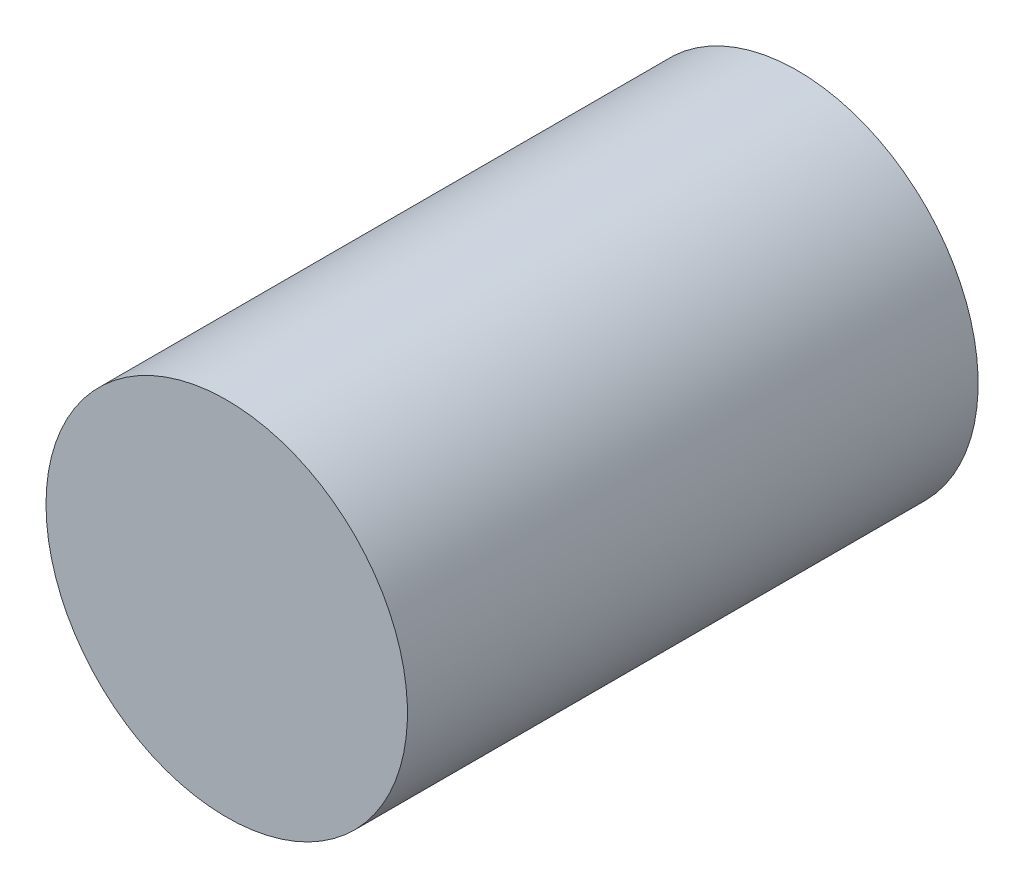
ISO-10303-21;
HEADER;
FILE_DESCRIPTION(('STEP AP214'),'2;1');
FILE_NAME('part.step','',(''),(''),'','','');
FILE_SCHEMA(('AUTOMOTIVE_DESIGN { 1 0 10303 214 1 1 1 1 }'));
ENDSEC;
DATA;
#1=APPLICATION_CONTEXT('core data for automotive mechanical design processes');
#2=APPLICATION_PROTOCOL_DEFINITION('international standard','automotive_design',2000,#1);
#3=PRODUCT_CONTEXT('',#1,'mechanical');
#4=PRODUCT('Part','Part','',(#3));
#5=PRODUCT_RELATED_PRODUCT_CATEGORY('part','',(#4));
#6=PRODUCT_DEFINITION_FORMATION('','',#4);
#7=PRODUCT_DEFINITION_CONTEXT('part definition',#1,'design');
#8=PRODUCT_DEFINITION('design','',#6,#7);
#9=PRODUCT_DEFINITION_SHAPE('','',#8);
#10=(LENGTH_UNIT() NAMED_UNIT(*) SI_UNIT(.MILLI.,.METRE.));
#11=(NAMED_UNIT(*) PLANE_ANGLE_UNIT() SI_UNIT($,.RADIAN.));
#12=(NAMED_UNIT(*) SI_UNIT($,.STERADIAN.) SOLID_ANGLE_UNIT());
#13=UNCERTAINTY_MEASURE_WITH_UNIT(LENGTH_MEASURE(1.E-05),#10,'distance_accuracy_value','');
#14=(GEOMETRIC_REPRESENTATION_CONTEXT(3) GLOBAL_UNCERTAINTY_ASSIGNED_CONTEXT((#13)) GLOBAL_UNIT_ASSIGNED_CONTEXT((#10,
#11,#12)) REPRESENTATION_CONTEXT('',''));
#15=CARTESIAN_POINT('',(0.,0.,0.));
#16=DIRECTION('',(0.,0.,1.));
#17=DIRECTION('',(1.,0.,0.));
#18=AXIS2_PLACEMENT_3D('',#15,#16,#17);
#19=CARTESIAN_POINT('',(-12.4312439650112,18.1884263878374,38.1));
#20=DIRECTION('',(0.,0.,-1.));
#21=DIRECTION('',(-1.,0.,0.));
#22=AXIS2_PLACEMENT_3D('',#19,#20,#21);
#23=CYLINDRICAL_SURFACE('',#22,12.065);
#24=CARTESIAN_POINT('',(-12.4312439650112,18.1884263878374,38.1));
#25=DIRECTION('',(0.,0.,1.));
#26=DIRECTION('',(1.,0.,0.));
#27=AXIS2_PLACEMENT_3D('',#24,#25,#26);
#28=CIRCLE('',#27,12.065);
#29=CARTESIAN_POINT('',(-24.4962439650112,18.1884263878374,38.1));
#30=VERTEX_POINT('',#29);
#31=EDGE_CURVE('E10',#30,#30,#28,.T.);
#32=CARTESIAN_POINT('',(-12.4312439650112,18.1884263878374,0.));
#33=DIRECTION('',(0.,0.,1.));
#34=DIRECTION('',(1.,0.,0.));
#35=AXIS2_PLACEMENT_3D('',#32,#33,#34);
#36=CIRCLE('',#35,12.065);
#37=CARTESIAN_POINT('',(-24.4962439650112,18.1884263878374,0.));
#38=VERTEX_POINT('',#37);
#39=EDGE_CURVE('E40',#38,#38,#36,.T.);
#40=CARTESIAN_POINT('',(-24.4962439650112,18.1884263878374,38.1));
#41=CARTESIAN_POINT('',(-24.4962439650112,18.1884263878374,37.703125));
#42=CARTESIAN_POINT('',(-24.4962439650112,18.1884263878374,37.30625));
#43=CARTESIAN_POINT('',(-24.4962439650112,18.1884263878374,36.5125));
#44=CARTESIAN_POINT('',(-24.4962439650112,18.1884263878374,36.115625));
#45=CARTESIAN_POINT('',(-24.4962439650112,18.1884263878374,35.321875));
#46=CARTESIAN_POINT('',(-24.4962439650112,18.1884263878374,34.925));
#47=CARTESIAN_POINT('',(-24.4962439650112,18.1884263878374,34.13125));
#48=CARTESIAN_POINT('',(-24.4962439650112,18.1884263878374,33.734375));
#49=CARTESIAN_POINT('',(-24.4962439650112,18.1884263878374,32.940625));
#50=CARTESIAN_POINT('',(-24.4962439650112,18.1884263878374,32.54375));
#51=CARTESIAN_POINT('',(-24.4962439650112,18.1884263878374,31.75));
#52=CARTESIAN_POINT('',(-24.4962439650112,18.1884263878374,31.353125));
#53=CARTESIAN_POINT('',(-24.4962439650112,18.1884263878374,30.559375));
#54=CARTESIAN_POINT('',(-24.4962439650112,18.1884263878374,30.1625));
#55=CARTESIAN_POINT('',(-24.4962439650112,18.1884263878374,29.36875));
#56=CARTESIAN_POINT('',(-24.4962439650112,18.1884263878374,28.971875));
#57=CARTESIAN_POINT('',(-24.4962439650112,18.1884263878374,28.178125));
#58=CARTESIAN_POINT('',(-24.4962439650112,18.1884263878374,27.78125));
#59=CARTESIAN_POINT('',(-24.4962439650112,18.1884263878374,26.9875));
#60=CARTESIAN_POINT('',(-24.4962439650112,18.1884263878374,26.590625));
#61=CARTESIAN_POINT('',(-24.4962439650112,18.1884263878374,25.796875));
#62=CARTESIAN_POINT('',(-24.4962439650112,18.1884263878374,25.4));
#63=CARTESIAN_POINT('',(-24.4962439650112,18.1884263878374,24.60625));
#64=CARTESIAN_POINT('',(-24.4962439650112,18.1884263878374,24.209375));
#65=CARTESIAN_POINT('',(-24.4962439650112,18.1884263878374,23.415625));
#66=CARTESIAN_POINT('',(-24.4962439650112,18.1884263878374,23.01875));
#67=CARTESIAN_POINT('',(-24.4962439650112,18.1884263878374,22.225));
#68=CARTESIAN_POINT('',(-24.4962439650112,18.1884263878374,21.828125));
#69=CARTESIAN_POINT('',(-24.4962439650112,18.1884263878374,21.034375));
#70=CARTESIAN_POINT('',(-24.4962439650112,18.1884263878374,20.6375));
#71=CARTESIAN_POINT('',(-24.4962439650112,18.1884263878374,19.84375));
#72=CARTESIAN_POINT('',(-24.4962439650112,18.1884263878374,19.446875));
#73=CARTESIAN_POINT('',(-24.4962439650112,18.1884263878374,18.653125));
#74=CARTESIAN_POINT('',(-24.4962439650112,18.1884263878374,18.25625));
#75=CARTESIAN_POINT('',(-24.4962439650112,18.1884263878374,17.4625));
#76=CARTESIAN_POINT('',(-24.4962439650112,18.1884263878374,17.065625));
#77=CARTESIAN_POINT('',(-24.4962439650112,18.1884263878374,16.271875));
#78=CARTESIAN_POINT('',(-24.4962439650112,18.1884263878374,15.875));
#79=CARTESIAN_POINT('',(-24.4962439650112,18.1884263878374,15.08125));
#80=CARTESIAN_POINT('',(-24.4962439650112,18.1884263878374,14.684375));
#81=CARTESIAN_POINT('',(-24.4962439650112,18.1884263878374,13.890625));
#82=CARTESIAN_POINT('',(-24.4962439650112,18.1884263878374,13.49375));
#83=CARTESIAN_POINT('',(-24.4962439650112,18.1884263878374,12.7));
#84=CARTESIAN_POINT('',(-24.4962439650112,18.1884263878374,12.303125));
#85=CARTESIAN_POINT('',(-24.4962439650112,18.1884263878374,11.509375));
#86=CARTESIAN_POINT('',(-24.4962439650112,18.1884263878374,11.1125));
#87=CARTESIAN_POINT('',(-24.4962439650112,18.1884263878374,10.31875));
#88=CARTESIAN_POINT('',(-24.4962439650112,18.1884263878374,9.92187499999999));
#89=CARTESIAN_POINT('',(-24.4962439650112,18.1884263878374,9.128125));
#90=CARTESIAN_POINT('',(-24.4962439650112,18.1884263878374,8.73124999999999));
#91=CARTESIAN_POINT('',(-24.4962439650112,18.1884263878374,7.93749999999999));
#92=CARTESIAN_POINT('',(-24.4962439650112,18.1884263878374,7.54062499999999));
#93=CARTESIAN_POINT('',(-24.4962439650112,18.1884263878374,6.746875));
#94=CARTESIAN_POINT('',(-24.4962439650112,18.1884263878374,6.35));
#95=CARTESIAN_POINT('',(-24.4962439650112,18.1884263878374,5.55625));
#96=CARTESIAN_POINT('',(-24.4962439650112,18.1884263878374,5.159375));
#97=CARTESIAN_POINT('',(-24.4962439650112,18.1884263878374,4.365625));
#98=CARTESIAN_POINT('',(-24.4962439650112,18.1884263878374,3.96875));
#99=CARTESIAN_POINT('',(-24.4962439650112,18.1884263878374,3.175));
#100=CARTESIAN_POINT('',(-24.4962439650112,18.1884263878374,2.778125));
#101=CARTESIAN_POINT('',(-24.4962439650112,18.1884263878374,1.984375));
#102=CARTESIAN_POINT('',(-24.4962439650112,18.1884263878374,1.5875));
#103=CARTESIAN_POINT('',(-24.4962439650112,18.1884263878374,0.79375));
#104=CARTESIAN_POINT('',(-24.4962439650112,18.1884263878374,0.396875));
#105=CARTESIAN_POINT('',(-24.4962439650112,18.1884263878374,0.));
#106=B_SPLINE_CURVE_WITH_KNOTS('',3,(#40,#41,#42,#43,#44,#45,#46,#47,#48,#49,#50,#51,#52,#53,
#54,#55,#56,#57,#58,#59,#60,#61,#62,#63,#64,#65,#66,#67,#68,#69,#70,#71,#72,#73,#74,#75,#76,#77,
#78,#79,#80,#81,#82,#83,#84,#85,#86,#87,#88,#89,#90,#91,#92,#93,#94,#95,#96,#97,#98,#99,#100,
#101,#102,#103,#104,#105),.UNSPECIFIED.,.F.,.F.,(4,2,2,2,2,2,2,2,2,2,2,2,2,2,2,2,2,2,2,2,2,2,2,
2,2,2,2,2,2,2,2,2,4),(0.,1.190625,2.38125,3.571875,4.7625,5.953125,7.14375,8.334375,
9.52500000000001,10.715625,11.90625,13.096875,14.2875,15.478125,16.66875,17.859375,19.05,
20.240625,21.43125,22.621875,23.8125,25.003125,26.19375,27.384375,28.575,29.765625,30.95625,
32.146875,33.3375,34.528125,35.71875,36.909375,38.1),.UNSPECIFIED.);
#107=EDGE_CURVE('BSEAM37',#30,#38,#106,.T.);
#108=ORIENTED_EDGE('',*,*,#31,.F.);
#109=ORIENTED_EDGE('',*,*,#39,.T.);
#110=ORIENTED_EDGE('',*,*,#107,.T.);
#111=ORIENTED_EDGE('',*,*,#107,.F.);
#112=EDGE_LOOP('',(#108,#110,#109,#111));
#113=FACE_BOUND('',#112,.T.);
#114=ADVANCED_FACE('F37',(#113),#23,.T.);
#115=CARTESIAN_POINT('',(-12.4312439650112,18.1884263878374,38.1));
#116=DIRECTION('',(0.,0.,1.));
#117=DIRECTION('',(1.,0.,0.));
#118=AXIS2_PLACEMENT_3D('',#115,#116,#117);
#119=PLANE('',#118);
#120=ORIENTED_EDGE('',*,*,#31,.T.);
#121=EDGE_LOOP('',(#120));
#122=FACE_BOUND('',#121,.T.);
#123=ADVANCED_FACE('F54',(#122),#119,.T.);
#124=CARTESIAN_POINT('',(-12.4312439650112,18.1884263878374,0.));
#125=DIRECTION('',(0.,0.,1.));
#126=DIRECTION('',(1.,0.,0.));
#127=AXIS2_PLACEMENT_3D('',#124,#125,#126);
#128=PLANE('',#127);
#129=ORIENTED_EDGE('',*,*,#39,.F.);
#130=EDGE_LOOP('',(#129));
#131=FACE_BOUND('',#130,.T.);
#132=ADVANCED_FACE('F52',(#131),#128,.F.);
#133=CLOSED_SHELL('',(#114,#123,#132));
#134=MANIFOLD_SOLID_BREP('B2',#133);
#135=ADVANCED_BREP_SHAPE_REPRESENTATION('',(#18,#134),#14);
#136=SHAPE_DEFINITION_REPRESENTATION(#9,#135);
ENDSEC;
END-ISO-10303-21;
